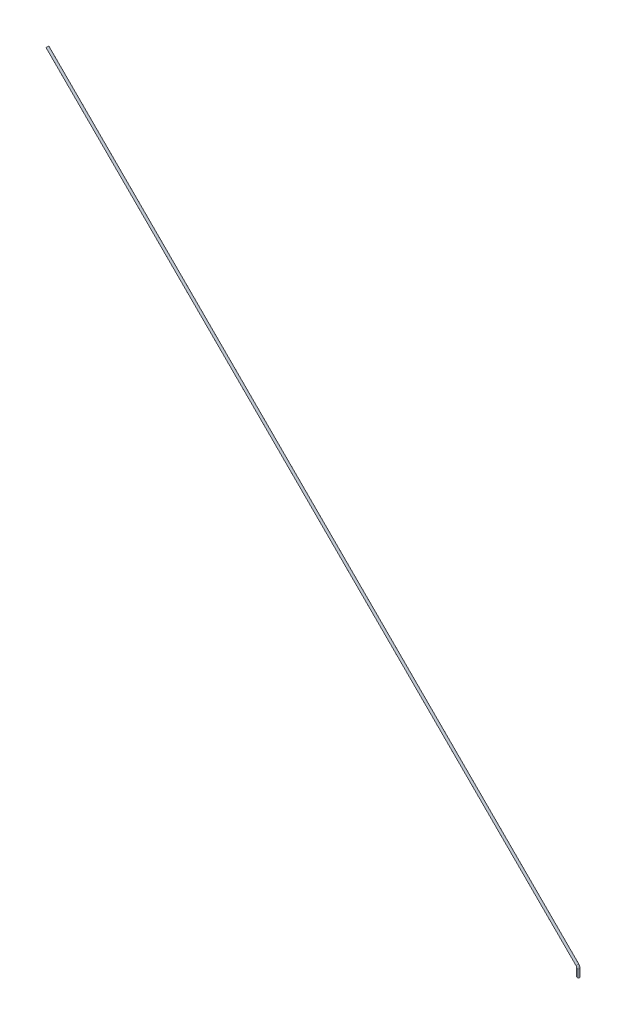
ISO-10303-21;
HEADER;
FILE_DESCRIPTION(('STEP AP214'),'2;1');
FILE_NAME('part.step','',(''),(''),'','','');
FILE_SCHEMA(('AUTOMOTIVE_DESIGN { 1 0 10303 214 1 1 1 1 }'));
ENDSEC;
DATA;
#1=APPLICATION_CONTEXT('core data for automotive mechanical design processes');
#2=APPLICATION_PROTOCOL_DEFINITION('international standard','automotive_design',2000,#1);
#3=PRODUCT_CONTEXT('',#1,'mechanical');
#4=PRODUCT('Part','Part','',(#3));
#5=PRODUCT_RELATED_PRODUCT_CATEGORY('part','',(#4));
#6=PRODUCT_DEFINITION_FORMATION('','',#4);
#7=PRODUCT_DEFINITION_CONTEXT('part definition',#1,'design');
#8=PRODUCT_DEFINITION('design','',#6,#7);
#9=PRODUCT_DEFINITION_SHAPE('','',#8);
#10=(LENGTH_UNIT() NAMED_UNIT(*) SI_UNIT(.MILLI.,.METRE.));
#11=(NAMED_UNIT(*) PLANE_ANGLE_UNIT() SI_UNIT($,.RADIAN.));
#12=(NAMED_UNIT(*) SI_UNIT($,.STERADIAN.) SOLID_ANGLE_UNIT());
#13=UNCERTAINTY_MEASURE_WITH_UNIT(LENGTH_MEASURE(1.E-05),#10,'distance_accuracy_value','');
#14=(GEOMETRIC_REPRESENTATION_CONTEXT(3) GLOBAL_UNCERTAINTY_ASSIGNED_CONTEXT((#13)) GLOBAL_UNIT_ASSIGNED_CONTEXT((#10,
#11,#12)) REPRESENTATION_CONTEXT('',''));
#15=CARTESIAN_POINT('',(0.,0.,0.));
#16=DIRECTION('',(0.,0.,1.));
#17=DIRECTION('',(1.,0.,0.));
#18=AXIS2_PLACEMENT_3D('',#15,#16,#17);
#19=CARTESIAN_POINT('',(-0.749999999999502,1.68933982821968,0.));
#20=DIRECTION('',(0.,0.,1.));
#21=DIRECTION('',(1.,0.,0.));
#22=AXIS2_PLACEMENT_3D('',#19,#20,#21);
#23=TOROIDAL_SURFACE('',#22,0.749999999999999,0.25);
#24=CARTESIAN_POINT('',(0.,1.68933982821969,0.));
#25=DIRECTION('',(0.,-1.,0.));
#26=DIRECTION('',(1.,0.,0.));
#27=AXIS2_PLACEMENT_3D('',#24,#25,#26);
#28=CIRCLE('',#27,0.25);
#29=CARTESIAN_POINT('',(0.250000000000497,1.68933982821969,0.));
#30=VERTEX_POINT('',#29);
#31=EDGE_CURVE('E41',#30,#30,#28,.T.);
#32=CARTESIAN_POINT('',(-0.219669914109593,2.21966991410959,0.));
#33=DIRECTION('',(-0.707106781186549,0.707106781186546,0.));
#34=DIRECTION('',(0.707106781186546,0.707106781186549,0.));
#35=AXIS2_PLACEMENT_3D('',#32,#33,#34);
#36=CIRCLE('',#35,0.25);
#37=CARTESIAN_POINT('',(-0.0428932188129568,2.39644660940623,0.));
#38=VERTEX_POINT('',#37);
#39=EDGE_CURVE('E10',#38,#38,#36,.T.);
#40=CARTESIAN_POINT('',(-0.749999999999502,1.68933982821968,0.));
#41=DIRECTION('',(0.,0.,1.));
#42=DIRECTION('',(1.,0.,0.));
#43=AXIS2_PLACEMENT_3D('',#40,#41,#42);
#44=CIRCLE('',#43,0.999999999999999);
#45=EDGE_CURVE('',#30,#38,#44,.T.);
#46=ORIENTED_EDGE('',*,*,#31,.F.);
#47=ORIENTED_EDGE('',*,*,#39,.F.);
#48=ORIENTED_EDGE('',*,*,#45,.T.);
#49=ORIENTED_EDGE('',*,*,#45,.F.);
#50=EDGE_LOOP('',(#46,#48,#47,#49));
#51=FACE_BOUND('',#50,.T.);
#52=ADVANCED_FACE('F31',(#51),#23,.T.);
#53=CARTESIAN_POINT('',(0.,-4.93311988480905E-13,0.));
#54=DIRECTION('',(0.,1.,0.));
#55=DIRECTION('',(-1.,0.,0.));
#56=AXIS2_PLACEMENT_3D('',#53,#54,#55);
#57=CYLINDRICAL_SURFACE('',#56,0.25);
#58=CARTESIAN_POINT('',(0.,-4.93311988480905E-13,0.));
#59=DIRECTION('',(0.,-1.,0.));
#60=DIRECTION('',(1.,0.,0.));
#61=AXIS2_PLACEMENT_3D('',#58,#59,#60);
#62=CIRCLE('',#61,0.25);
#63=CARTESIAN_POINT('',(0.250000000000011,-4.91716042883006E-13,0.));
#64=VERTEX_POINT('',#63);
#65=EDGE_CURVE('E37',#64,#64,#62,.T.);
#66=ORIENTED_EDGE('',*,*,#65,.F.);
#67=EDGE_LOOP('',(#66));
#68=FACE_BOUND('',#67,.T.);
#69=ORIENTED_EDGE('',*,*,#31,.T.);
#70=EDGE_LOOP('',(#69));
#71=FACE_BOUND('',#70,.T.);
#72=ADVANCED_FACE('F62',(#68,#71),#57,.T.);
#73=CARTESIAN_POINT('',(0.,-4.93311988480905E-13,0.));
#74=DIRECTION('',(0.,-1.,0.));
#75=DIRECTION('',(1.,0.,0.));
#76=AXIS2_PLACEMENT_3D('',#73,#74,#75);
#77=PLANE('',#76);
#78=ORIENTED_EDGE('',*,*,#65,.T.);
#79=EDGE_LOOP('',(#78));
#80=FACE_BOUND('',#79,.T.);
#81=ADVANCED_FACE('F55',(#80),#77,.T.);
#82=CARTESIAN_POINT('',(-115.258405333407,117.258405333407,0.));
#83=DIRECTION('',(0.707106781186549,-0.707106781186546,0.));
#84=DIRECTION('',(0.707106781186546,0.707106781186549,0.));
#85=AXIS2_PLACEMENT_3D('',#82,#83,#84);
#86=CYLINDRICAL_SURFACE('',#85,0.25);
#87=CARTESIAN_POINT('',(-115.258405333407,117.258405333407,0.));
#88=DIRECTION('',(-0.707106781186549,0.707106781186546,0.));
#89=DIRECTION('',(-0.707106781186546,-0.707106781186549,0.));
#90=AXIS2_PLACEMENT_3D('',#87,#88,#89);
#91=CIRCLE('',#90,0.25);
#92=CARTESIAN_POINT('',(-115.435182028704,117.08162863811,0.));
#93=VERTEX_POINT('',#92);
#94=EDGE_CURVE('E46',#93,#93,#91,.T.);
#95=ORIENTED_EDGE('',*,*,#94,.F.);
#96=EDGE_LOOP('',(#95));
#97=FACE_BOUND('',#96,.T.);
#98=ORIENTED_EDGE('',*,*,#39,.T.);
#99=EDGE_LOOP('',(#98));
#100=FACE_BOUND('',#99,.T.);
#101=ADVANCED_FACE('F53',(#97,#100),#86,.T.);
#102=CARTESIAN_POINT('',(-115.258405333407,117.258405333407,0.));
#103=DIRECTION('',(-0.707106781186549,0.707106781186546,0.));
#104=DIRECTION('',(-0.707106781186546,-0.707106781186549,0.));
#105=AXIS2_PLACEMENT_3D('',#102,#103,#104);
#106=PLANE('',#105);
#107=ORIENTED_EDGE('',*,*,#94,.T.);
#108=EDGE_LOOP('',(#107));
#109=FACE_BOUND('',#108,.T.);
#110=ADVANCED_FACE('F51',(#109),#106,.T.);
#111=CLOSED_SHELL('',(#52,#72,#81,#101,#110));
#112=MANIFOLD_SOLID_BREP('B2',#111);
#113=ADVANCED_BREP_SHAPE_REPRESENTATION('',(#18,#112),#14);
#114=SHAPE_DEFINITION_REPRESENTATION(#9,#113);
ENDSEC;
END-ISO-10303-21;
